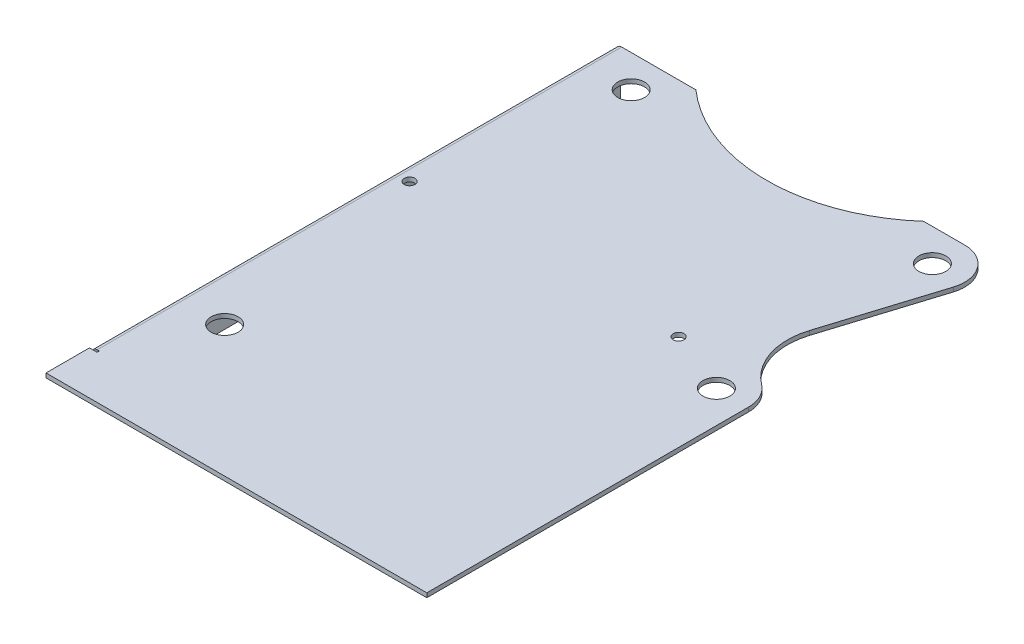
ISO-10303-21;
HEADER;
FILE_DESCRIPTION(('STEP AP214'),'2;1');
FILE_NAME('part.step','',(''),(''),'','','');
FILE_SCHEMA(('AUTOMOTIVE_DESIGN { 1 0 10303 214 1 1 1 1 }'));
ENDSEC;
DATA;
#1=APPLICATION_CONTEXT('core data for automotive mechanical design processes');
#2=APPLICATION_PROTOCOL_DEFINITION('international standard','automotive_design',2000,#1);
#3=PRODUCT_CONTEXT('',#1,'mechanical');
#4=PRODUCT('Part','Part','',(#3));
#5=PRODUCT_RELATED_PRODUCT_CATEGORY('part','',(#4));
#6=PRODUCT_DEFINITION_FORMATION('','',#4);
#7=PRODUCT_DEFINITION_CONTEXT('part definition',#1,'design');
#8=PRODUCT_DEFINITION('design','',#6,#7);
#9=PRODUCT_DEFINITION_SHAPE('','',#8);
#10=(LENGTH_UNIT() NAMED_UNIT(*) SI_UNIT(.MILLI.,.METRE.));
#11=(NAMED_UNIT(*) PLANE_ANGLE_UNIT() SI_UNIT($,.RADIAN.));
#12=(NAMED_UNIT(*) SI_UNIT($,.STERADIAN.) SOLID_ANGLE_UNIT());
#13=UNCERTAINTY_MEASURE_WITH_UNIT(LENGTH_MEASURE(1.E-05),#10,'distance_accuracy_value','');
#14=(GEOMETRIC_REPRESENTATION_CONTEXT(3) GLOBAL_UNCERTAINTY_ASSIGNED_CONTEXT((#13)) GLOBAL_UNIT_ASSIGNED_CONTEXT((#10,
#11,#12)) REPRESENTATION_CONTEXT('',''));
#15=CARTESIAN_POINT('',(0.,0.,0.));
#16=DIRECTION('',(0.,0.,1.));
#17=DIRECTION('',(1.,0.,0.));
#18=AXIS2_PLACEMENT_3D('',#15,#16,#17);
#19=CARTESIAN_POINT('',(-67.2020833010404,-2.54,-336.55));
#20=DIRECTION('',(0.,0.,-1.));
#21=DIRECTION('',(-1.,0.,0.));
#22=AXIS2_PLACEMENT_3D('',#19,#20,#21);
#23=PLANE('',#22);
#24=DIRECTION('',(-1.,0.,0.));
#25=VECTOR('',#24,1.);
#26=CARTESIAN_POINT('',(-67.2020833010404,-2.54,-336.55));
#27=LINE('',#26,#25);
#28=CARTESIAN_POINT('',(-67.2020833010405,-2.54,-336.55));
#29=VERTEX_POINT('',#28);
#30=CARTESIAN_POINT('',(-111.0234,-2.54000000000004,-336.55));
#31=VERTEX_POINT('',#30);
#32=EDGE_CURVE('E269',#29,#31,#27,.T.);
#33=ORIENTED_EDGE('',*,*,#32,.T.);
#34=DIRECTION('',(0.,1.,0.));
#35=VECTOR('',#34,1.);
#36=CARTESIAN_POINT('',(-111.0234,-2.54000000000004,-336.55));
#37=LINE('',#36,#35);
#38=CARTESIAN_POINT('',(-111.0234,0.,-336.55));
#39=VERTEX_POINT('',#38);
#40=EDGE_CURVE('E432',#31,#39,#37,.T.);
#41=ORIENTED_EDGE('',*,*,#40,.T.);
#42=DIRECTION('',(-1.,0.,0.));
#43=VECTOR('',#42,1.);
#44=CARTESIAN_POINT('',(-67.2020833010404,0.,-336.55));
#45=LINE('',#44,#43);
#46=CARTESIAN_POINT('',(-67.2020833010405,0.,-336.55));
#47=VERTEX_POINT('',#46);
#48=EDGE_CURVE('E232',#47,#39,#45,.T.);
#49=ORIENTED_EDGE('',*,*,#48,.F.);
#50=DIRECTION('',(0.,1.,0.));
#51=VECTOR('',#50,1.);
#52=CARTESIAN_POINT('',(-67.2020833010405,-2.54,-336.55));
#53=LINE('',#52,#51);
#54=EDGE_CURVE('E109',#29,#47,#53,.T.);
#55=ORIENTED_EDGE('',*,*,#54,.F.);
#56=EDGE_LOOP('',(#33,#41,#49,#55));
#57=FACE_BOUND('',#56,.T.);
#58=ADVANCED_FACE('F79',(#57),#23,.T.);
#59=CARTESIAN_POINT('',(-114.3,-2.54,0.));
#60=DIRECTION('',(-1.,0.,0.));
#61=DIRECTION('',(0.,0.,1.));
#62=AXIS2_PLACEMENT_3D('',#59,#60,#61);
#63=PLANE('',#62);
#64=DIRECTION('',(0.,0.,1.));
#65=VECTOR('',#64,1.);
#66=CARTESIAN_POINT('',(-114.3,0.,0.));
#67=LINE('',#66,#65);
#68=CARTESIAN_POINT('',(-114.3,0.,-25.6540000000018));
#69=VERTEX_POINT('',#68);
#70=CARTESIAN_POINT('',(-114.3,0.,0.));
#71=VERTEX_POINT('',#70);
#72=EDGE_CURVE('E236',#69,#71,#67,.T.);
#73=ORIENTED_EDGE('',*,*,#72,.F.);
#74=DIRECTION('',(0.,1.,0.));
#75=VECTOR('',#74,1.);
#76=CARTESIAN_POINT('',(-114.3,-2.53999999999998,-25.6540000000018));
#77=LINE('',#76,#75);
#78=CARTESIAN_POINT('',(-114.3,-2.53999999999998,-25.6540000000018));
#79=VERTEX_POINT('',#78);
#80=EDGE_CURVE('E97',#79,#69,#77,.T.);
#81=ORIENTED_EDGE('',*,*,#80,.F.);
#82=DIRECTION('',(0.,0.,1.));
#83=VECTOR('',#82,1.);
#84=CARTESIAN_POINT('',(-114.3,-2.54,0.));
#85=LINE('',#84,#83);
#86=CARTESIAN_POINT('',(-114.3,-2.54,0.));
#87=VERTEX_POINT('',#86);
#88=EDGE_CURVE('E164',#79,#87,#85,.T.);
#89=ORIENTED_EDGE('',*,*,#88,.T.);
#90=DIRECTION('',(0.,1.,0.));
#91=VECTOR('',#90,1.);
#92=CARTESIAN_POINT('',(-114.3,-2.54,0.));
#93=LINE('',#92,#91);
#94=EDGE_CURVE('E231',#87,#71,#93,.T.);
#95=ORIENTED_EDGE('',*,*,#94,.T.);
#96=EDGE_LOOP('',(#73,#81,#89,#95));
#97=FACE_BOUND('',#96,.T.);
#98=ADVANCED_FACE('F413',(#97),#63,.T.);
#99=CARTESIAN_POINT('',(91.4400000000072,-2.54,-190.003314762675));
#100=DIRECTION('',(0.,1.,0.));
#101=DIRECTION('',(0.,0.,1.));
#102=AXIS2_PLACEMENT_3D('',#99,#100,#101);
#103=PLANE('',#102);
#104=CARTESIAN_POINT('',(-86.3600000000001,-2.54,-317.5));
#105=DIRECTION('',(0.,1.,0.));
#106=DIRECTION('',(0.,0.,1.));
#107=AXIS2_PLACEMENT_3D('',#104,#105,#106);
#108=CIRCLE('',#107,7.93749999999998);
#109=CARTESIAN_POINT('',(-86.3600000000001,-2.54,-309.5625));
#110=VERTEX_POINT('',#109);
#111=EDGE_CURVE('E237',#110,#110,#108,.T.);
#112=ORIENTED_EDGE('',*,*,#111,.T.);
#113=EDGE_LOOP('',(#112));
#114=FACE_BOUND('',#113,.T.);
#115=CARTESIAN_POINT('',(91.439999999998,-2.54,-317.5));
#116=DIRECTION('',(0.,1.,0.));
#117=DIRECTION('',(0.,0.,1.));
#118=AXIS2_PLACEMENT_3D('',#115,#116,#117);
#119=CIRCLE('',#118,7.93750000000405);
#120=CARTESIAN_POINT('',(91.439999999998,-2.54,-309.562499999996));
#121=VERTEX_POINT('',#120);
#122=EDGE_CURVE('E366',#121,#121,#119,.T.);
#123=ORIENTED_EDGE('',*,*,#122,.T.);
#124=EDGE_LOOP('',(#123));
#125=FACE_BOUND('',#124,.T.);
#126=CARTESIAN_POINT('',(91.4400000000072,-2.54,-190.003314762675));
#127=DIRECTION('',(0.,1.,0.));
#128=DIRECTION('',(0.,0.,1.));
#129=AXIS2_PLACEMENT_3D('',#126,#127,#128);
#130=CIRCLE('',#129,7.93749999999999);
#131=CARTESIAN_POINT('',(91.4400000000072,-2.54,-182.065814762675));
#132=VERTEX_POINT('',#131);
#133=EDGE_CURVE('E358',#132,#132,#130,.T.);
#134=ORIENTED_EDGE('',*,*,#133,.T.);
#135=EDGE_LOOP('',(#134));
#136=FACE_BOUND('',#135,.T.);
#137=CARTESIAN_POINT('',(-86.3600000000017,-2.54,-77.5033147626738));
#138=DIRECTION('',(0.,1.,0.));
#139=DIRECTION('',(0.,0.,1.));
#140=AXIS2_PLACEMENT_3D('',#137,#138,#139);
#141=CIRCLE('',#140,7.93750000000116);
#142=CARTESIAN_POINT('',(-86.3600000000017,-2.54,-69.5658147626726));
#143=VERTEX_POINT('',#142);
#144=EDGE_CURVE('E350',#143,#143,#141,.T.);
#145=ORIENTED_EDGE('',*,*,#144,.T.);
#146=EDGE_LOOP('',(#145));
#147=FACE_BOUND('',#146,.T.);
#148=CARTESIAN_POINT('',(-104.900544931293,-2.54,-205.245559798394));
#149=DIRECTION('',(0.,1.,0.));
#150=DIRECTION('',(0.,0.,1.));
#151=AXIS2_PLACEMENT_3D('',#148,#149,#150);
#152=CIRCLE('',#151,3.175);
#153=CARTESIAN_POINT('',(-104.900544931293,-2.54,-202.070559798394));
#154=VERTEX_POINT('',#153);
#155=EDGE_CURVE('E342',#154,#154,#152,.T.);
#156=ORIENTED_EDGE('',*,*,#155,.T.);
#157=EDGE_LOOP('',(#156));
#158=FACE_BOUND('',#157,.T.);
#159=CARTESIAN_POINT('',(53.8766601907323,-2.54,-205.245559798394));
#160=DIRECTION('',(0.,1.,0.));
#161=DIRECTION('',(0.,0.,1.));
#162=AXIS2_PLACEMENT_3D('',#159,#160,#161);
#163=CIRCLE('',#162,3.175);
#164=CARTESIAN_POINT('',(53.8766601907323,-2.54,-202.070559798394));
#165=VERTEX_POINT('',#164);
#166=EDGE_CURVE('E333',#165,#165,#163,.T.);
#167=ORIENTED_EDGE('',*,*,#166,.T.);
#168=EDGE_LOOP('',(#167));
#169=FACE_BOUND('',#168,.T.);
#170=DIRECTION('',(0.,0.,-1.));
#171=VECTOR('',#170,1.);
#172=CARTESIAN_POINT('',(-111.0234,-2.54000000000004,-336.55));
#173=LINE('',#172,#171);
#174=CARTESIAN_POINT('',(-111.0234,-2.53999999999995,-26.9240000000018));
#175=VERTEX_POINT('',#174);
#176=EDGE_CURVE('E437',#31,#175,#173,.F.);
#177=ORIENTED_EDGE('',*,*,#176,.F.);
#178=ORIENTED_EDGE('',*,*,#32,.F.);
#179=CARTESIAN_POINT('',(0.,-2.54,-412.75));
#180=DIRECTION('',(0.,-1.,0.));
#181=DIRECTION('',(0.,0.,1.));
#182=AXIS2_PLACEMENT_3D('',#179,#180,#181);
#183=CIRCLE('',#182,101.6);
#184=CARTESIAN_POINT('',(67.2020833010404,-2.54,-336.55));
#185=VERTEX_POINT('',#184);
#186=EDGE_CURVE('E215',#185,#29,#183,.T.);
#187=ORIENTED_EDGE('',*,*,#186,.F.);
#188=DIRECTION('',(-1.,0.,0.));
#189=VECTOR('',#188,1.);
#190=CARTESIAN_POINT('',(91.439999999998,-2.54,-336.55));
#191=LINE('',#190,#189);
#192=CARTESIAN_POINT('',(91.439999999998,-2.54,-336.550000000001));
#193=VERTEX_POINT('',#192);
#194=EDGE_CURVE('E196',#193,#185,#191,.T.);
#195=ORIENTED_EDGE('',*,*,#194,.F.);
#196=CARTESIAN_POINT('',(91.439999999998,-2.54,-317.5));
#197=DIRECTION('',(0.,1.,0.));
#198=DIRECTION('',(0.,0.,1.));
#199=AXIS2_PLACEMENT_3D('',#196,#197,#198);
#200=CIRCLE('',#199,19.0500000000006);
#201=CARTESIAN_POINT('',(109.61952843583,-2.54,-311.807263764161));
#202=VERTEX_POINT('',#201);
#203=EDGE_CURVE('E213',#202,#193,#200,.T.);
#204=ORIENTED_EDGE('',*,*,#203,.F.);
#205=DIRECTION('',(0.298831298469229,0.,-0.954305954636769));
#206=VECTOR('',#205,1.);
#207=CARTESIAN_POINT('',(109.61952843583,-2.54,-311.807263764161));
#208=LINE('',#207,#206);
#209=CARTESIAN_POINT('',(89.3619611476497,-2.54,-247.115522341511));
#210=VERTEX_POINT('',#209);
#211=EDGE_CURVE('E220',#210,#202,#208,.T.);
#212=ORIENTED_EDGE('',*,*,#211,.F.);
#213=CARTESIAN_POINT('',(125.721018019311,-2.54,-235.730049869832));
#214=DIRECTION('',(0.,-1.,0.));
#215=DIRECTION('',(0.,0.,1.));
#216=AXIS2_PLACEMENT_3D('',#213,#214,#215);
#217=CIRCLE('',#216,38.1000000000012);
#218=CARTESIAN_POINT('',(102.867006006441,-2.54,-205.245559798394));
#219=VERTEX_POINT('',#218);
#220=EDGE_CURVE('E225',#219,#210,#217,.T.);
#221=ORIENTED_EDGE('',*,*,#220,.F.);
#222=CARTESIAN_POINT('',(91.4400000000072,-2.54,-190.003314762675));
#223=DIRECTION('',(0.,1.,0.));
#224=DIRECTION('',(0.,0.,1.));
#225=AXIS2_PLACEMENT_3D('',#222,#223,#224);
#226=CIRCLE('',#225,19.05);
#227=CARTESIAN_POINT('',(110.490000000007,-2.54,-190.003314762675));
#228=VERTEX_POINT('',#227);
#229=EDGE_CURVE('E391',#228,#219,#226,.T.);
#230=ORIENTED_EDGE('',*,*,#229,.F.);
#231=DIRECTION('',(0.,0.,-1.));
#232=VECTOR('',#231,1.);
#233=CARTESIAN_POINT('',(110.490000000007,-2.54,-190.003314762675));
#234=LINE('',#233,#232);
#235=CARTESIAN_POINT('',(110.490000000007,-2.54,0.));
#236=VERTEX_POINT('',#235);
#237=EDGE_CURVE('E387',#236,#228,#234,.T.);
#238=ORIENTED_EDGE('',*,*,#237,.F.);
#239=DIRECTION('',(1.,0.,0.));
#240=VECTOR('',#239,1.);
#241=CARTESIAN_POINT('',(110.490000000007,-2.54,0.));
#242=LINE('',#241,#240);
#243=EDGE_CURVE('E383',#87,#236,#242,.T.);
#244=ORIENTED_EDGE('',*,*,#243,.F.);
#245=ORIENTED_EDGE('',*,*,#88,.F.);
#246=DIRECTION('',(-1.,0.,0.));
#247=VECTOR('',#246,1.);
#248=CARTESIAN_POINT('',(-109.7534,-2.53999999999995,-25.6540000000018));
#249=LINE('',#248,#247);
#250=CARTESIAN_POINT('',(-109.7534,-2.53999999999995,-25.6540000000018));
#251=VERTEX_POINT('',#250);
#252=EDGE_CURVE('E329',#251,#79,#249,.T.);
#253=ORIENTED_EDGE('',*,*,#252,.F.);
#254=DIRECTION('',(0.,0.,1.));
#255=VECTOR('',#254,1.);
#256=CARTESIAN_POINT('',(-109.7534,-2.53999999999995,-26.9240000000018));
#257=LINE('',#256,#255);
#258=CARTESIAN_POINT('',(-109.7534,-2.53999999999995,-26.9240000000018));
#259=VERTEX_POINT('',#258);
#260=EDGE_CURVE('E323',#259,#251,#257,.T.);
#261=ORIENTED_EDGE('',*,*,#260,.F.);
#262=DIRECTION('',(1.,0.,0.));
#263=VECTOR('',#262,1.);
#264=CARTESIAN_POINT('',(-111.0234,-2.53999999999995,-26.9240000000018));
#265=LINE('',#264,#263);
#266=EDGE_CURVE('E321',#175,#259,#265,.T.);
#267=ORIENTED_EDGE('',*,*,#266,.F.);
#268=EDGE_LOOP('',(#177,#178,#187,#195,#204,#212,#221,#230,#238,#244,#245,#253,#261,#267));
#269=FACE_BOUND('',#268,.T.);
#270=ADVANCED_FACE('F211',(#114,#125,#136,#147,#158,#169,#269),#103,.F.);
#271=CARTESIAN_POINT('',(91.4400000000072,0.,-190.003314762675));
#272=DIRECTION('',(0.,1.,0.));
#273=DIRECTION('',(0.,0.,1.));
#274=AXIS2_PLACEMENT_3D('',#271,#272,#273);
#275=PLANE('',#274);
#276=CARTESIAN_POINT('',(53.8766601907323,0.,-205.245559798394));
#277=DIRECTION('',(0.,1.,0.));
#278=DIRECTION('',(0.,0.,1.));
#279=AXIS2_PLACEMENT_3D('',#276,#277,#278);
#280=CIRCLE('',#279,3.175);
#281=CARTESIAN_POINT('',(53.8766601907323,0.,-202.070559798394));
#282=VERTEX_POINT('',#281);
#283=EDGE_CURVE('E338',#282,#282,#280,.T.);
#284=ORIENTED_EDGE('',*,*,#283,.F.);
#285=EDGE_LOOP('',(#284));
#286=FACE_BOUND('',#285,.T.);
#287=CARTESIAN_POINT('',(-104.900544931293,0.,-205.245559798394));
#288=DIRECTION('',(0.,1.,0.));
#289=DIRECTION('',(0.,0.,1.));
#290=AXIS2_PLACEMENT_3D('',#287,#288,#289);
#291=CIRCLE('',#290,3.175);
#292=CARTESIAN_POINT('',(-104.900544931293,0.,-202.070559798394));
#293=VERTEX_POINT('',#292);
#294=EDGE_CURVE('E337',#293,#293,#291,.T.);
#295=ORIENTED_EDGE('',*,*,#294,.F.);
#296=EDGE_LOOP('',(#295));
#297=FACE_BOUND('',#296,.T.);
#298=CARTESIAN_POINT('',(-86.3600000000017,0.,-77.5033147626738));
#299=DIRECTION('',(0.,1.,0.));
#300=DIRECTION('',(0.,0.,1.));
#301=AXIS2_PLACEMENT_3D('',#298,#299,#300);
#302=CIRCLE('',#301,7.93750000000116);
#303=CARTESIAN_POINT('',(-86.3600000000017,0.,-69.5658147626726));
#304=VERTEX_POINT('',#303);
#305=EDGE_CURVE('E346',#304,#304,#302,.T.);
#306=ORIENTED_EDGE('',*,*,#305,.F.);
#307=EDGE_LOOP('',(#306));
#308=FACE_BOUND('',#307,.T.);
#309=CARTESIAN_POINT('',(91.4400000000072,0.,-190.003314762675));
#310=DIRECTION('',(0.,1.,0.));
#311=DIRECTION('',(0.,0.,1.));
#312=AXIS2_PLACEMENT_3D('',#309,#310,#311);
#313=CIRCLE('',#312,7.93749999999999);
#314=CARTESIAN_POINT('',(91.4400000000072,0.,-182.065814762675));
#315=VERTEX_POINT('',#314);
#316=EDGE_CURVE('E354',#315,#315,#313,.T.);
#317=ORIENTED_EDGE('',*,*,#316,.F.);
#318=EDGE_LOOP('',(#317));
#319=FACE_BOUND('',#318,.T.);
#320=CARTESIAN_POINT('',(91.439999999998,0.,-317.5));
#321=DIRECTION('',(0.,1.,0.));
#322=DIRECTION('',(0.,0.,1.));
#323=AXIS2_PLACEMENT_3D('',#320,#321,#322);
#324=CIRCLE('',#323,7.93750000000405);
#325=CARTESIAN_POINT('',(91.439999999998,0.,-309.562499999996));
#326=VERTEX_POINT('',#325);
#327=EDGE_CURVE('E362',#326,#326,#324,.T.);
#328=ORIENTED_EDGE('',*,*,#327,.F.);
#329=EDGE_LOOP('',(#328));
#330=FACE_BOUND('',#329,.T.);
#331=CARTESIAN_POINT('',(-86.3600000000001,0.,-317.5));
#332=DIRECTION('',(0.,1.,0.));
#333=DIRECTION('',(0.,0.,1.));
#334=AXIS2_PLACEMENT_3D('',#331,#332,#333);
#335=CIRCLE('',#334,7.93749999999998);
#336=CARTESIAN_POINT('',(-86.3600000000001,0.,-309.5625));
#337=VERTEX_POINT('',#336);
#338=EDGE_CURVE('E370',#337,#337,#335,.T.);
#339=ORIENTED_EDGE('',*,*,#338,.F.);
#340=EDGE_LOOP('',(#339));
#341=FACE_BOUND('',#340,.T.);
#342=ORIENTED_EDGE('',*,*,#48,.T.);
#343=DIRECTION('',(0.,0.,-1.));
#344=VECTOR('',#343,1.);
#345=CARTESIAN_POINT('',(-111.0234,0.,-336.55));
#346=LINE('',#345,#344);
#347=CARTESIAN_POINT('',(-111.0234,0.,-26.9240000000018));
#348=VERTEX_POINT('',#347);
#349=EDGE_CURVE('E440',#39,#348,#346,.F.);
#350=ORIENTED_EDGE('',*,*,#349,.T.);
#351=DIRECTION('',(1.,0.,0.));
#352=VECTOR('',#351,1.);
#353=CARTESIAN_POINT('',(91.4400000000072,0.,-26.9240000000018));
#354=LINE('',#353,#352);
#355=CARTESIAN_POINT('',(-109.7534,0.,-26.9240000000018));
#356=VERTEX_POINT('',#355);
#357=EDGE_CURVE('E15',#348,#356,#354,.T.);
#358=ORIENTED_EDGE('',*,*,#357,.T.);
#359=DIRECTION('',(0.,0.,1.));
#360=VECTOR('',#359,1.);
#361=CARTESIAN_POINT('',(-109.7534,0.,-190.003314762675));
#362=LINE('',#361,#360);
#363=CARTESIAN_POINT('',(-109.7534,0.,-25.6540000000018));
#364=VERTEX_POINT('',#363);
#365=EDGE_CURVE('E87',#356,#364,#362,.T.);
#366=ORIENTED_EDGE('',*,*,#365,.T.);
#367=DIRECTION('',(-1.,0.,0.));
#368=VECTOR('',#367,1.);
#369=CARTESIAN_POINT('',(91.4400000000071,0.,-25.6540000000016));
#370=LINE('',#369,#368);
#371=EDGE_CURVE('E272',#364,#69,#370,.T.);
#372=ORIENTED_EDGE('',*,*,#371,.T.);
#373=ORIENTED_EDGE('',*,*,#72,.T.);
#374=DIRECTION('',(1.,0.,0.));
#375=VECTOR('',#374,1.);
#376=CARTESIAN_POINT('',(110.490000000007,0.,0.));
#377=LINE('',#376,#375);
#378=CARTESIAN_POINT('',(110.490000000007,0.,0.));
#379=VERTEX_POINT('',#378);
#380=EDGE_CURVE('E240',#71,#379,#377,.T.);
#381=ORIENTED_EDGE('',*,*,#380,.T.);
#382=DIRECTION('',(0.,0.,-1.));
#383=VECTOR('',#382,1.);
#384=CARTESIAN_POINT('',(110.490000000007,0.,-190.003314762675));
#385=LINE('',#384,#383);
#386=CARTESIAN_POINT('',(110.490000000007,0.,-190.003314762675));
#387=VERTEX_POINT('',#386);
#388=EDGE_CURVE('E244',#379,#387,#385,.T.);
#389=ORIENTED_EDGE('',*,*,#388,.T.);
#390=CARTESIAN_POINT('',(91.4400000000072,0.,-190.003314762675));
#391=DIRECTION('',(0.,1.,0.));
#392=DIRECTION('',(0.,0.,1.));
#393=AXIS2_PLACEMENT_3D('',#390,#391,#392);
#394=CIRCLE('',#393,19.05);
#395=CARTESIAN_POINT('',(102.867006006441,0.,-205.245559798394));
#396=VERTEX_POINT('',#395);
#397=EDGE_CURVE('E248',#387,#396,#394,.T.);
#398=ORIENTED_EDGE('',*,*,#397,.T.);
#399=CARTESIAN_POINT('',(125.721018019311,0.,-235.730049869832));
#400=DIRECTION('',(0.,-1.,0.));
#401=DIRECTION('',(0.,0.,1.));
#402=AXIS2_PLACEMENT_3D('',#399,#400,#401);
#403=CIRCLE('',#402,38.1000000000012);
#404=CARTESIAN_POINT('',(89.3619611476497,0.,-247.115522341511));
#405=VERTEX_POINT('',#404);
#406=EDGE_CURVE('E252',#396,#405,#403,.T.);
#407=ORIENTED_EDGE('',*,*,#406,.T.);
#408=DIRECTION('',(0.298831298469229,0.,-0.954305954636769));
#409=VECTOR('',#408,1.);
#410=CARTESIAN_POINT('',(109.61952843583,0.,-311.807263764161));
#411=LINE('',#410,#409);
#412=CARTESIAN_POINT('',(109.61952843583,0.,-311.807263764161));
#413=VERTEX_POINT('',#412);
#414=EDGE_CURVE('E256',#405,#413,#411,.T.);
#415=ORIENTED_EDGE('',*,*,#414,.T.);
#416=CARTESIAN_POINT('',(91.439999999998,0.,-317.5));
#417=DIRECTION('',(0.,1.,0.));
#418=DIRECTION('',(0.,0.,1.));
#419=AXIS2_PLACEMENT_3D('',#416,#417,#418);
#420=CIRCLE('',#419,19.0500000000006);
#421=CARTESIAN_POINT('',(91.439999999998,0.,-336.550000000001));
#422=VERTEX_POINT('',#421);
#423=EDGE_CURVE('E260',#413,#422,#420,.T.);
#424=ORIENTED_EDGE('',*,*,#423,.T.);
#425=DIRECTION('',(-1.,0.,0.));
#426=VECTOR('',#425,1.);
#427=CARTESIAN_POINT('',(91.439999999998,0.,-336.55));
#428=LINE('',#427,#426);
#429=CARTESIAN_POINT('',(67.2020833010404,0.,-336.55));
#430=VERTEX_POINT('',#429);
#431=EDGE_CURVE('E199',#422,#430,#428,.T.);
#432=ORIENTED_EDGE('',*,*,#431,.T.);
#433=CARTESIAN_POINT('',(0.,0.,-412.75));
#434=DIRECTION('',(0.,-1.,0.));
#435=DIRECTION('',(0.,0.,1.));
#436=AXIS2_PLACEMENT_3D('',#433,#434,#435);
#437=CIRCLE('',#436,101.6);
#438=EDGE_CURVE('E265',#430,#47,#437,.T.);
#439=ORIENTED_EDGE('',*,*,#438,.T.);
#440=EDGE_LOOP('',(#342,#350,#358,#366,#372,#373,#381,#389,#398,#407,#415,#424,#432,#439));
#441=FACE_BOUND('',#440,.T.);
#442=ADVANCED_FACE('F298',(#286,#297,#308,#319,#330,#341,#441),#275,.T.);
#443=CARTESIAN_POINT('',(0.,-2.54,-412.75));
#444=DIRECTION('',(0.,1.,0.));
#445=DIRECTION('',(0.,0.,1.));
#446=AXIS2_PLACEMENT_3D('',#443,#444,#445);
#447=CYLINDRICAL_SURFACE('',#446,101.6);
#448=ORIENTED_EDGE('',*,*,#438,.F.);
#449=DIRECTION('',(0.,1.,0.));
#450=VECTOR('',#449,1.);
#451=CARTESIAN_POINT('',(67.2020833010404,-2.54,-336.55));
#452=LINE('',#451,#450);
#453=EDGE_CURVE('E205',#185,#430,#452,.T.);
#454=ORIENTED_EDGE('',*,*,#453,.F.);
#455=ORIENTED_EDGE('',*,*,#186,.T.);
#456=ORIENTED_EDGE('',*,*,#54,.T.);
#457=EDGE_LOOP('',(#448,#454,#455,#456));
#458=FACE_BOUND('',#457,.T.);
#459=ADVANCED_FACE('F438',(#458),#447,.F.);
#460=CARTESIAN_POINT('',(91.439999999998,-2.54,-336.55));
#461=DIRECTION('',(0.,0.,-1.));
#462=DIRECTION('',(-1.,0.,0.));
#463=AXIS2_PLACEMENT_3D('',#460,#461,#462);
#464=PLANE('',#463);
#465=ORIENTED_EDGE('',*,*,#431,.F.);
#466=DIRECTION('',(0.,1.,0.));
#467=VECTOR('',#466,1.);
#468=CARTESIAN_POINT('',(91.439999999998,-2.54,-336.550000000001));
#469=LINE('',#468,#467);
#470=EDGE_CURVE('E193',#193,#422,#469,.T.);
#471=ORIENTED_EDGE('',*,*,#470,.F.);
#472=ORIENTED_EDGE('',*,*,#194,.T.);
#473=ORIENTED_EDGE('',*,*,#453,.T.);
#474=EDGE_LOOP('',(#465,#471,#472,#473));
#475=FACE_BOUND('',#474,.T.);
#476=ADVANCED_FACE('F195',(#475),#464,.T.);
#477=CARTESIAN_POINT('',(91.439999999998,-2.54,-317.5));
#478=DIRECTION('',(0.,1.,0.));
#479=DIRECTION('',(0.,0.,1.));
#480=AXIS2_PLACEMENT_3D('',#477,#478,#479);
#481=CYLINDRICAL_SURFACE('',#480,19.0500000000006);
#482=ORIENTED_EDGE('',*,*,#423,.F.);
#483=DIRECTION('',(0.,1.,0.));
#484=VECTOR('',#483,1.);
#485=CARTESIAN_POINT('',(109.61952843583,-2.54,-311.807263764161));
#486=LINE('',#485,#484);
#487=EDGE_CURVE('E206',#202,#413,#486,.T.);
#488=ORIENTED_EDGE('',*,*,#487,.F.);
#489=ORIENTED_EDGE('',*,*,#203,.T.);
#490=ORIENTED_EDGE('',*,*,#470,.T.);
#491=EDGE_LOOP('',(#482,#488,#489,#490));
#492=FACE_BOUND('',#491,.T.);
#493=ADVANCED_FACE('F218',(#492),#481,.T.);
#494=CARTESIAN_POINT('',(109.61952843583,-2.54,-311.807263764161));
#495=DIRECTION('',(0.954305954636769,0.,0.298831298469229));
#496=DIRECTION('',(0.298831298469229,0.,-0.954305954636769));
#497=AXIS2_PLACEMENT_3D('',#494,#495,#496);
#498=PLANE('',#497);
#499=ORIENTED_EDGE('',*,*,#414,.F.);
#500=DIRECTION('',(0.,1.,0.));
#501=VECTOR('',#500,1.);
#502=CARTESIAN_POINT('',(89.3619611476497,-2.54,-247.115522341511));
#503=LINE('',#502,#501);
#504=EDGE_CURVE('E277',#210,#405,#503,.T.);
#505=ORIENTED_EDGE('',*,*,#504,.F.);
#506=ORIENTED_EDGE('',*,*,#211,.T.);
#507=ORIENTED_EDGE('',*,*,#487,.T.);
#508=EDGE_LOOP('',(#499,#505,#506,#507));
#509=FACE_BOUND('',#508,.T.);
#510=ADVANCED_FACE('F415',(#509),#498,.T.);
#511=CARTESIAN_POINT('',(125.721018019311,-2.54,-235.730049869832));
#512=DIRECTION('',(0.,1.,0.));
#513=DIRECTION('',(0.,0.,1.));
#514=AXIS2_PLACEMENT_3D('',#511,#512,#513);
#515=CYLINDRICAL_SURFACE('',#514,38.1000000000012);
#516=ORIENTED_EDGE('',*,*,#406,.F.);
#517=DIRECTION('',(0.,1.,0.));
#518=VECTOR('',#517,1.);
#519=CARTESIAN_POINT('',(102.867006006441,-2.54,-205.245559798394));
#520=LINE('',#519,#518);
#521=EDGE_CURVE('E280',#219,#396,#520,.T.);
#522=ORIENTED_EDGE('',*,*,#521,.F.);
#523=ORIENTED_EDGE('',*,*,#220,.T.);
#524=ORIENTED_EDGE('',*,*,#504,.T.);
#525=EDGE_LOOP('',(#516,#522,#523,#524));
#526=FACE_BOUND('',#525,.T.);
#527=ADVANCED_FACE('F399',(#526),#515,.F.);
#528=CARTESIAN_POINT('',(91.4400000000072,-2.54,-190.003314762675));
#529=DIRECTION('',(0.,1.,0.));
#530=DIRECTION('',(0.,0.,1.));
#531=AXIS2_PLACEMENT_3D('',#528,#529,#530);
#532=CYLINDRICAL_SURFACE('',#531,19.05);
#533=ORIENTED_EDGE('',*,*,#397,.F.);
#534=DIRECTION('',(0.,1.,0.));
#535=VECTOR('',#534,1.);
#536=CARTESIAN_POINT('',(110.490000000007,-2.54,-190.003314762675));
#537=LINE('',#536,#535);
#538=EDGE_CURVE('E283',#228,#387,#537,.T.);
#539=ORIENTED_EDGE('',*,*,#538,.F.);
#540=ORIENTED_EDGE('',*,*,#229,.T.);
#541=ORIENTED_EDGE('',*,*,#521,.T.);
#542=EDGE_LOOP('',(#533,#539,#540,#541));
#543=FACE_BOUND('',#542,.T.);
#544=ADVANCED_FACE('F405',(#543),#532,.T.);
#545=CARTESIAN_POINT('',(110.490000000007,-2.54,-190.003314762675));
#546=DIRECTION('',(1.,0.,0.));
#547=DIRECTION('',(0.,0.,-1.));
#548=AXIS2_PLACEMENT_3D('',#545,#546,#547);
#549=PLANE('',#548);
#550=ORIENTED_EDGE('',*,*,#388,.F.);
#551=DIRECTION('',(0.,1.,0.));
#552=VECTOR('',#551,1.);
#553=CARTESIAN_POINT('',(110.490000000007,-2.54,0.));
#554=LINE('',#553,#552);
#555=EDGE_CURVE('E286',#236,#379,#554,.T.);
#556=ORIENTED_EDGE('',*,*,#555,.F.);
#557=ORIENTED_EDGE('',*,*,#237,.T.);
#558=ORIENTED_EDGE('',*,*,#538,.T.);
#559=EDGE_LOOP('',(#550,#556,#557,#558));
#560=FACE_BOUND('',#559,.T.);
#561=ADVANCED_FACE('F408',(#560),#549,.T.);
#562=CARTESIAN_POINT('',(110.490000000007,-2.54,0.));
#563=DIRECTION('',(0.,0.,1.));
#564=DIRECTION('',(1.,0.,0.));
#565=AXIS2_PLACEMENT_3D('',#562,#563,#564);
#566=PLANE('',#565);
#567=ORIENTED_EDGE('',*,*,#380,.F.);
#568=ORIENTED_EDGE('',*,*,#94,.F.);
#569=ORIENTED_EDGE('',*,*,#243,.T.);
#570=ORIENTED_EDGE('',*,*,#555,.T.);
#571=EDGE_LOOP('',(#567,#568,#569,#570));
#572=FACE_BOUND('',#571,.T.);
#573=ADVANCED_FACE('F412',(#572),#566,.T.);
#574=CARTESIAN_POINT('',(-86.3600000000001,-2.54,-317.5));
#575=DIRECTION('',(0.,1.,0.));
#576=DIRECTION('',(0.,0.,1.));
#577=AXIS2_PLACEMENT_3D('',#574,#575,#576);
#578=CYLINDRICAL_SURFACE('',#577,7.93749999999998);
#579=ORIENTED_EDGE('',*,*,#111,.F.);
#580=EDGE_LOOP('',(#579));
#581=FACE_BOUND('',#580,.T.);
#582=ORIENTED_EDGE('',*,*,#338,.T.);
#583=EDGE_LOOP('',(#582));
#584=FACE_BOUND('',#583,.T.);
#585=ADVANCED_FACE('F627',(#581,#584),#578,.F.);
#586=CARTESIAN_POINT('',(91.439999999998,-2.54,-317.5));
#587=DIRECTION('',(0.,1.,0.));
#588=DIRECTION('',(0.,0.,1.));
#589=AXIS2_PLACEMENT_3D('',#586,#587,#588);
#590=CYLINDRICAL_SURFACE('',#589,7.93750000000405);
#591=ORIENTED_EDGE('',*,*,#122,.F.);
#592=EDGE_LOOP('',(#591));
#593=FACE_BOUND('',#592,.T.);
#594=ORIENTED_EDGE('',*,*,#327,.T.);
#595=EDGE_LOOP('',(#594));
#596=FACE_BOUND('',#595,.T.);
#597=ADVANCED_FACE('F623',(#593,#596),#590,.F.);
#598=CARTESIAN_POINT('',(91.4400000000072,-2.54,-190.003314762675));
#599=DIRECTION('',(0.,1.,0.));
#600=DIRECTION('',(0.,0.,1.));
#601=AXIS2_PLACEMENT_3D('',#598,#599,#600);
#602=CYLINDRICAL_SURFACE('',#601,7.93749999999999);
#603=ORIENTED_EDGE('',*,*,#133,.F.);
#604=EDGE_LOOP('',(#603));
#605=FACE_BOUND('',#604,.T.);
#606=ORIENTED_EDGE('',*,*,#316,.T.);
#607=EDGE_LOOP('',(#606));
#608=FACE_BOUND('',#607,.T.);
#609=ADVANCED_FACE('F619',(#605,#608),#602,.F.);
#610=CARTESIAN_POINT('',(-86.3600000000017,-2.54,-77.5033147626738));
#611=DIRECTION('',(0.,1.,0.));
#612=DIRECTION('',(0.,0.,1.));
#613=AXIS2_PLACEMENT_3D('',#610,#611,#612);
#614=CYLINDRICAL_SURFACE('',#613,7.93750000000116);
#615=ORIENTED_EDGE('',*,*,#144,.F.);
#616=EDGE_LOOP('',(#615));
#617=FACE_BOUND('',#616,.T.);
#618=ORIENTED_EDGE('',*,*,#305,.T.);
#619=EDGE_LOOP('',(#618));
#620=FACE_BOUND('',#619,.T.);
#621=ADVANCED_FACE('F615',(#617,#620),#614,.F.);
#622=CARTESIAN_POINT('',(-104.900544931293,-2.54,-205.245559798394));
#623=DIRECTION('',(0.,1.,0.));
#624=DIRECTION('',(0.,0.,1.));
#625=AXIS2_PLACEMENT_3D('',#622,#623,#624);
#626=CYLINDRICAL_SURFACE('',#625,3.175);
#627=ORIENTED_EDGE('',*,*,#155,.F.);
#628=EDGE_LOOP('',(#627));
#629=FACE_BOUND('',#628,.T.);
#630=ORIENTED_EDGE('',*,*,#294,.T.);
#631=EDGE_LOOP('',(#630));
#632=FACE_BOUND('',#631,.T.);
#633=ADVANCED_FACE('F611',(#629,#632),#626,.F.);
#634=CARTESIAN_POINT('',(53.8766601907323,-2.54,-205.245559798394));
#635=DIRECTION('',(0.,1.,0.));
#636=DIRECTION('',(0.,0.,1.));
#637=AXIS2_PLACEMENT_3D('',#634,#635,#636);
#638=CYLINDRICAL_SURFACE('',#637,3.175);
#639=ORIENTED_EDGE('',*,*,#166,.F.);
#640=EDGE_LOOP('',(#639));
#641=FACE_BOUND('',#640,.T.);
#642=ORIENTED_EDGE('',*,*,#283,.T.);
#643=EDGE_LOOP('',(#642));
#644=FACE_BOUND('',#643,.T.);
#645=ADVANCED_FACE('F608',(#641,#644),#638,.F.);
#646=CARTESIAN_POINT('',(-111.0234,-2.53999999999995,-26.9240000000018));
#647=DIRECTION('',(0.,0.,1.));
#648=DIRECTION('',(0.,-1.,0.));
#649=AXIS2_PLACEMENT_3D('',#646,#647,#648);
#650=PLANE('',#649);
#651=ORIENTED_EDGE('',*,*,#357,.F.);
#652=DIRECTION('',(0.,1.,0.));
#653=VECTOR('',#652,1.);
#654=CARTESIAN_POINT('',(-111.0234,-2.53999999999995,-26.9240000000018));
#655=LINE('',#654,#653);
#656=EDGE_CURVE('E471',#175,#348,#655,.T.);
#657=ORIENTED_EDGE('',*,*,#656,.F.);
#658=ORIENTED_EDGE('',*,*,#266,.T.);
#659=DIRECTION('',(0.,1.,0.));
#660=VECTOR('',#659,1.);
#661=CARTESIAN_POINT('',(-109.7534,-2.53999999999995,-26.9240000000018));
#662=LINE('',#661,#660);
#663=EDGE_CURVE('E313',#259,#356,#662,.T.);
#664=ORIENTED_EDGE('',*,*,#663,.T.);
#665=EDGE_LOOP('',(#651,#657,#658,#664));
#666=FACE_BOUND('',#665,.T.);
#667=ADVANCED_FACE('F318',(#666),#650,.T.);
#668=CARTESIAN_POINT('',(-109.7534,-2.53999999999995,-26.9240000000018));
#669=DIRECTION('',(-1.,0.,0.));
#670=DIRECTION('',(0.,0.,1.));
#671=AXIS2_PLACEMENT_3D('',#668,#669,#670);
#672=PLANE('',#671);
#673=ORIENTED_EDGE('',*,*,#365,.F.);
#674=ORIENTED_EDGE('',*,*,#663,.F.);
#675=ORIENTED_EDGE('',*,*,#260,.T.);
#676=DIRECTION('',(0.,1.,0.));
#677=VECTOR('',#676,1.);
#678=CARTESIAN_POINT('',(-109.7534,-2.53999999999995,-25.6540000000018));
#679=LINE('',#678,#677);
#680=EDGE_CURVE('E316',#251,#364,#679,.T.);
#681=ORIENTED_EDGE('',*,*,#680,.T.);
#682=EDGE_LOOP('',(#673,#674,#675,#681));
#683=FACE_BOUND('',#682,.T.);
#684=ADVANCED_FACE('F310',(#683),#672,.T.);
#685=CARTESIAN_POINT('',(-109.7534,-2.53999999999995,-25.6540000000018));
#686=DIRECTION('',(0.,0.,-1.));
#687=DIRECTION('',(-1.,0.,0.));
#688=AXIS2_PLACEMENT_3D('',#685,#686,#687);
#689=PLANE('',#688);
#690=ORIENTED_EDGE('',*,*,#371,.F.);
#691=ORIENTED_EDGE('',*,*,#680,.F.);
#692=ORIENTED_EDGE('',*,*,#252,.T.);
#693=ORIENTED_EDGE('',*,*,#80,.T.);
#694=EDGE_LOOP('',(#690,#691,#692,#693));
#695=FACE_BOUND('',#694,.T.);
#696=ADVANCED_FACE('F466',(#695),#689,.T.);
#697=CARTESIAN_POINT('',(-111.0234,-3.27659999999997,-26.9240000000018));
#698=DIRECTION('',(0.,0.,1.));
#699=DIRECTION('',(0.,-1.,0.));
#700=AXIS2_PLACEMENT_3D('',#697,#698,#699);
#701=PLANE('',#700);
#702=DIRECTION('',(-1.,0.,0.));
#703=VECTOR('',#702,1.);
#704=CARTESIAN_POINT('',(-114.3,-3.2766,-26.9240000000018));
#705=LINE('',#704,#703);
#706=CARTESIAN_POINT('',(-111.76,-3.27659999999997,-26.9240000000018));
#707=VERTEX_POINT('',#706);
#708=CARTESIAN_POINT('',(-114.3,-3.27659999999996,-26.9240000000018));
#709=VERTEX_POINT('',#708);
#710=EDGE_CURVE('E499',#707,#709,#705,.T.);
#711=ORIENTED_EDGE('',*,*,#710,.F.);
#712=CARTESIAN_POINT('',(-111.0234,-3.27659999999997,-26.9240000000018));
#713=DIRECTION('',(0.,0.,-1.));
#714=DIRECTION('',(0.,1.,0.));
#715=AXIS2_PLACEMENT_3D('',#712,#713,#714);
#716=CIRCLE('',#715,0.736600000000018);
#717=EDGE_CURVE('E488',#175,#707,#716,.F.);
#718=ORIENTED_EDGE('',*,*,#717,.F.);
#719=ORIENTED_EDGE('',*,*,#656,.T.);
#720=CARTESIAN_POINT('',(-111.0234,-3.27659999999997,-26.9240000000018));
#721=DIRECTION('',(0.,0.,-1.));
#722=DIRECTION('',(0.,1.,0.));
#723=AXIS2_PLACEMENT_3D('',#720,#721,#722);
#724=CIRCLE('',#723,3.27660000000002);
#725=EDGE_CURVE('E477',#348,#709,#724,.F.);
#726=ORIENTED_EDGE('',*,*,#725,.T.);
#727=EDGE_LOOP('',(#711,#718,#719,#726));
#728=FACE_BOUND('',#727,.T.);
#729=ADVANCED_FACE('F573',(#728),#701,.T.);
#730=CARTESIAN_POINT('',(-111.0234,-3.27660000000006,-336.55));
#731=DIRECTION('',(0.,0.,1.));
#732=DIRECTION('',(0.,-1.,0.));
#733=AXIS2_PLACEMENT_3D('',#730,#731,#732);
#734=PLANE('',#733);
#735=CARTESIAN_POINT('',(-111.0234,-3.27660000000006,-336.55));
#736=DIRECTION('',(0.,0.,-1.));
#737=DIRECTION('',(0.,1.,0.));
#738=AXIS2_PLACEMENT_3D('',#735,#736,#737);
#739=CIRCLE('',#738,0.736600000000018);
#740=CARTESIAN_POINT('',(-111.76,-3.27660000000006,-336.55));
#741=VERTEX_POINT('',#740);
#742=EDGE_CURVE('E481',#741,#31,#739,.T.);
#743=ORIENTED_EDGE('',*,*,#742,.F.);
#744=DIRECTION('',(-1.,0.,0.));
#745=VECTOR('',#744,1.);
#746=CARTESIAN_POINT('',(-111.76,-3.27660000000002,-336.55));
#747=LINE('',#746,#745);
#748=CARTESIAN_POINT('',(-114.3,-3.27660000000001,-336.55));
#749=VERTEX_POINT('',#748);
#750=EDGE_CURVE('E505',#741,#749,#747,.T.);
#751=ORIENTED_EDGE('',*,*,#750,.T.);
#752=CARTESIAN_POINT('',(-111.0234,-3.27660000000006,-336.55));
#753=DIRECTION('',(0.,0.,-1.));
#754=DIRECTION('',(0.,1.,0.));
#755=AXIS2_PLACEMENT_3D('',#752,#753,#754);
#756=CIRCLE('',#755,3.27660000000002);
#757=EDGE_CURVE('E492',#749,#39,#756,.T.);
#758=ORIENTED_EDGE('',*,*,#757,.T.);
#759=ORIENTED_EDGE('',*,*,#40,.F.);
#760=EDGE_LOOP('',(#743,#751,#758,#759));
#761=FACE_BOUND('',#760,.T.);
#762=ADVANCED_FACE('F566',(#761),#734,.F.);
#763=CARTESIAN_POINT('',(-111.0234,-3.27660000000006,-336.55));
#764=DIRECTION('',(0.,0.,-1.));
#765=DIRECTION('',(-1.,0.,0.));
#766=AXIS2_PLACEMENT_3D('',#763,#764,#765);
#767=CYLINDRICAL_SURFACE('',#766,3.27660000000002);
#768=ORIENTED_EDGE('',*,*,#349,.F.);
#769=ORIENTED_EDGE('',*,*,#757,.F.);
#770=DIRECTION('',(0.,0.,-1.));
#771=VECTOR('',#770,1.);
#772=CARTESIAN_POINT('',(-114.3,-3.27659999999999,0.));
#773=LINE('',#772,#771);
#774=EDGE_CURVE('E509',#709,#749,#773,.T.);
#775=ORIENTED_EDGE('',*,*,#774,.F.);
#776=ORIENTED_EDGE('',*,*,#725,.F.);
#777=EDGE_LOOP('',(#768,#769,#775,#776));
#778=FACE_BOUND('',#777,.T.);
#779=ADVANCED_FACE('F571',(#778),#767,.T.);
#780=CARTESIAN_POINT('',(-111.0234,-3.27660000000006,-336.55));
#781=DIRECTION('',(0.,0.,-1.));
#782=DIRECTION('',(-1.,0.,0.));
#783=AXIS2_PLACEMENT_3D('',#780,#781,#782);
#784=CYLINDRICAL_SURFACE('',#783,0.736600000000018);
#785=ORIENTED_EDGE('',*,*,#176,.T.);
#786=ORIENTED_EDGE('',*,*,#717,.T.);
#787=DIRECTION('',(0.,0.,1.));
#788=VECTOR('',#787,1.);
#789=CARTESIAN_POINT('',(-111.76,-3.2766,-26.9240000000018));
#790=LINE('',#789,#788);
#791=EDGE_CURVE('E502',#707,#741,#790,.F.);
#792=ORIENTED_EDGE('',*,*,#791,.T.);
#793=ORIENTED_EDGE('',*,*,#742,.T.);
#794=EDGE_LOOP('',(#785,#786,#792,#793));
#795=FACE_BOUND('',#794,.T.);
#796=ADVANCED_FACE('F589',(#795),#784,.F.);
#797=CARTESIAN_POINT('',(-114.3,-2.53999999999999,-336.55));
#798=DIRECTION('',(0.,0.,-1.));
#799=DIRECTION('',(-1.,0.,0.));
#800=AXIS2_PLACEMENT_3D('',#797,#798,#799);
#801=PLANE('',#800);
#802=DIRECTION('',(0.,1.,0.));
#803=VECTOR('',#802,1.);
#804=CARTESIAN_POINT('',(-114.3,-2.53999999999999,-336.55));
#805=LINE('',#804,#803);
#806=CARTESIAN_POINT('',(-114.3,-27.94,-336.55));
#807=VERTEX_POINT('',#806);
#808=EDGE_CURVE('E533',#807,#749,#805,.T.);
#809=ORIENTED_EDGE('',*,*,#808,.T.);
#810=ORIENTED_EDGE('',*,*,#750,.F.);
#811=DIRECTION('',(0.,-1.,0.));
#812=VECTOR('',#811,1.);
#813=CARTESIAN_POINT('',(-111.76,3.7470027081099E-13,-336.55));
#814=LINE('',#813,#812);
#815=CARTESIAN_POINT('',(-111.76,-27.94,-336.55));
#816=VERTEX_POINT('',#815);
#817=EDGE_CURVE('E521',#816,#741,#814,.F.);
#818=ORIENTED_EDGE('',*,*,#817,.F.);
#819=DIRECTION('',(1.,0.,0.));
#820=VECTOR('',#819,1.);
#821=CARTESIAN_POINT('',(-114.3,-27.94,-336.55));
#822=LINE('',#821,#820);
#823=EDGE_CURVE('E485',#807,#816,#822,.T.);
#824=ORIENTED_EDGE('',*,*,#823,.F.);
#825=EDGE_LOOP('',(#809,#810,#818,#824));
#826=FACE_BOUND('',#825,.T.);
#827=ADVANCED_FACE('F563',(#826),#801,.T.);
#828=CARTESIAN_POINT('',(-114.3,-27.94,-26.9240000000018));
#829=DIRECTION('',(0.,0.,1.));
#830=DIRECTION('',(0.,-1.,0.));
#831=AXIS2_PLACEMENT_3D('',#828,#829,#830);
#832=PLANE('',#831);
#833=DIRECTION('',(0.,1.,0.));
#834=VECTOR('',#833,1.);
#835=CARTESIAN_POINT('',(-111.76,3.82055498349132E-13,-26.9240000000018));
#836=LINE('',#835,#834);
#837=CARTESIAN_POINT('',(-111.76,-27.94,-26.9240000000018));
#838=VERTEX_POINT('',#837);
#839=EDGE_CURVE('E513',#707,#838,#836,.F.);
#840=ORIENTED_EDGE('',*,*,#839,.F.);
#841=ORIENTED_EDGE('',*,*,#710,.T.);
#842=DIRECTION('',(0.,-1.,0.));
#843=VECTOR('',#842,1.);
#844=CARTESIAN_POINT('',(-114.3,-27.94,-26.9240000000018));
#845=LINE('',#844,#843);
#846=CARTESIAN_POINT('',(-114.3,-27.94,-26.9240000000018));
#847=VERTEX_POINT('',#846);
#848=EDGE_CURVE('E525',#709,#847,#845,.T.);
#849=ORIENTED_EDGE('',*,*,#848,.T.);
#850=DIRECTION('',(1.,0.,0.));
#851=VECTOR('',#850,1.);
#852=CARTESIAN_POINT('',(-114.3,-27.94,-26.9240000000018));
#853=LINE('',#852,#851);
#854=EDGE_CURVE('E537',#847,#838,#853,.T.);
#855=ORIENTED_EDGE('',*,*,#854,.T.);
#856=EDGE_LOOP('',(#840,#841,#849,#855));
#857=FACE_BOUND('',#856,.T.);
#858=ADVANCED_FACE('F576',(#857),#832,.T.);
#859=CARTESIAN_POINT('',(-114.3,3.83568633411652E-13,0.));
#860=DIRECTION('',(-1.,0.,0.));
#861=DIRECTION('',(0.,-1.,0.));
#862=AXIS2_PLACEMENT_3D('',#859,#860,#861);
#863=PLANE('',#862);
#864=ORIENTED_EDGE('',*,*,#848,.F.);
#865=ORIENTED_EDGE('',*,*,#774,.T.);
#866=ORIENTED_EDGE('',*,*,#808,.F.);
#867=DIRECTION('',(0.,0.,-1.));
#868=VECTOR('',#867,1.);
#869=CARTESIAN_POINT('',(-114.3,-27.94,-336.55));
#870=LINE('',#869,#868);
#871=EDGE_CURVE('E529',#847,#807,#870,.T.);
#872=ORIENTED_EDGE('',*,*,#871,.F.);
#873=EDGE_LOOP('',(#864,#865,#866,#872));
#874=FACE_BOUND('',#873,.T.);
#875=ADVANCED_FACE('F570',(#874),#863,.T.);
#876=CARTESIAN_POINT('',(-111.76,3.7470027081099E-13,0.));
#877=DIRECTION('',(-1.,0.,0.));
#878=DIRECTION('',(0.,-1.,0.));
#879=AXIS2_PLACEMENT_3D('',#876,#877,#878);
#880=PLANE('',#879);
#881=ORIENTED_EDGE('',*,*,#791,.F.);
#882=ORIENTED_EDGE('',*,*,#839,.T.);
#883=DIRECTION('',(0.,0.,1.));
#884=VECTOR('',#883,1.);
#885=CARTESIAN_POINT('',(-111.76,-27.94,0.));
#886=LINE('',#885,#884);
#887=EDGE_CURVE('E517',#838,#816,#886,.F.);
#888=ORIENTED_EDGE('',*,*,#887,.T.);
#889=ORIENTED_EDGE('',*,*,#817,.T.);
#890=EDGE_LOOP('',(#881,#882,#888,#889));
#891=FACE_BOUND('',#890,.T.);
#892=ADVANCED_FACE('F560',(#891),#880,.F.);
#893=CARTESIAN_POINT('',(-114.3,-27.94,-336.55));
#894=DIRECTION('',(0.,-1.,0.));
#895=DIRECTION('',(1.,0.,0.));
#896=AXIS2_PLACEMENT_3D('',#893,#894,#895);
#897=PLANE('',#896);
#898=ORIENTED_EDGE('',*,*,#887,.F.);
#899=ORIENTED_EDGE('',*,*,#854,.F.);
#900=ORIENTED_EDGE('',*,*,#871,.T.);
#901=ORIENTED_EDGE('',*,*,#823,.T.);
#902=EDGE_LOOP('',(#898,#899,#900,#901));
#903=FACE_BOUND('',#902,.T.);
#904=ADVANCED_FACE('F547',(#903),#897,.T.);
#905=CLOSED_SHELL('',(#58,#98,#270,#442,#459,#476,#493,#510,#527,#544,#561,#573,#585,#597,#609,
#621,#633,#645,#667,#684,#696,#729,#762,#779,#796,#827,#858,#875,#892,#904));
#906=MANIFOLD_SOLID_BREP('B2',#905);
#907=ADVANCED_BREP_SHAPE_REPRESENTATION('',(#18,#906),#14);
#908=SHAPE_DEFINITION_REPRESENTATION(#9,#907);
ENDSEC;
END-ISO-10303-21;
